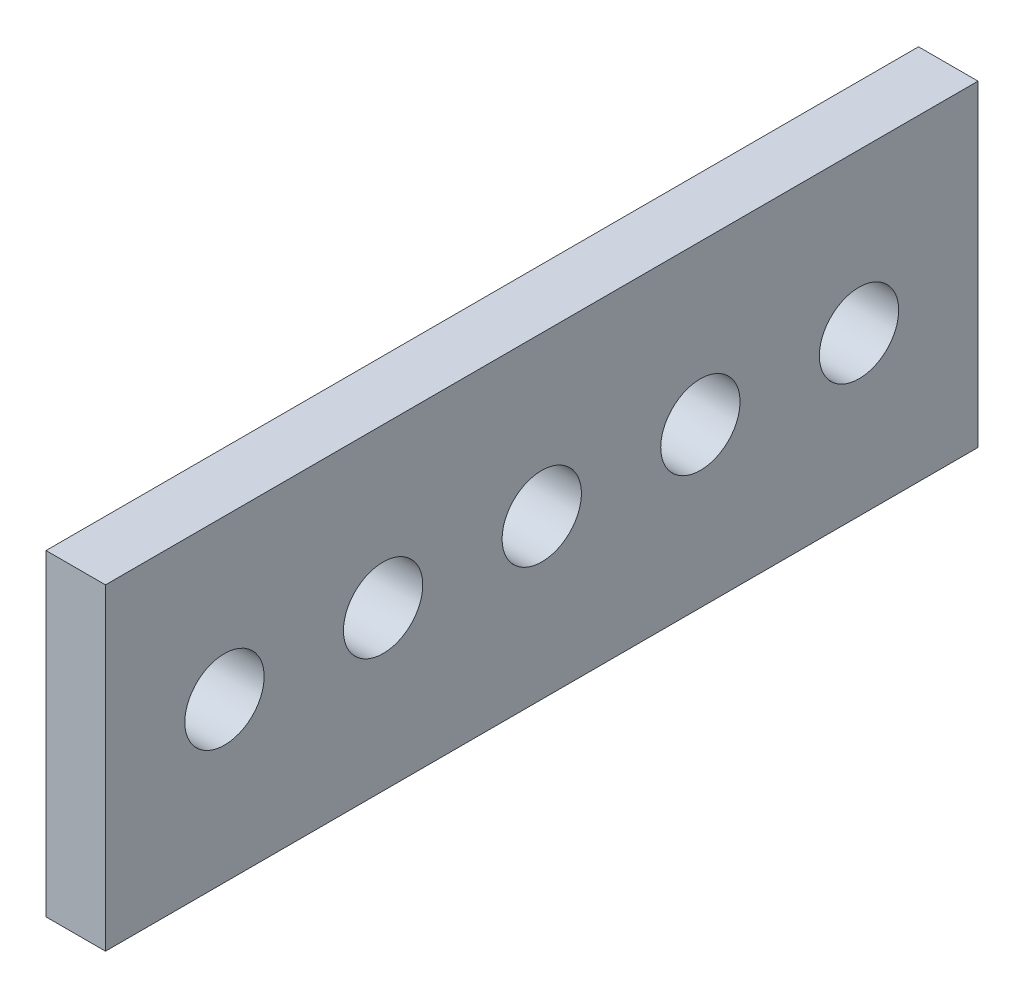
ISO-10303-21;
HEADER;
FILE_DESCRIPTION(('STEP AP214'),'2;1');
FILE_NAME('part.step','',(''),(''),'','','');
FILE_SCHEMA(('AUTOMOTIVE_DESIGN { 1 0 10303 214 1 1 1 1 }'));
ENDSEC;
DATA;
#1=APPLICATION_CONTEXT('core data for automotive mechanical design processes');
#2=APPLICATION_PROTOCOL_DEFINITION('international standard','automotive_design',2000,#1);
#3=PRODUCT_CONTEXT('',#1,'mechanical');
#4=PRODUCT('Part','Part','',(#3));
#5=PRODUCT_RELATED_PRODUCT_CATEGORY('part','',(#4));
#6=PRODUCT_DEFINITION_FORMATION('','',#4);
#7=PRODUCT_DEFINITION_CONTEXT('part definition',#1,'design');
#8=PRODUCT_DEFINITION('design','',#6,#7);
#9=PRODUCT_DEFINITION_SHAPE('','',#8);
#10=(LENGTH_UNIT() NAMED_UNIT(*) SI_UNIT(.MILLI.,.METRE.));
#11=(NAMED_UNIT(*) PLANE_ANGLE_UNIT() SI_UNIT($,.RADIAN.));
#12=(NAMED_UNIT(*) SI_UNIT($,.STERADIAN.) SOLID_ANGLE_UNIT());
#13=UNCERTAINTY_MEASURE_WITH_UNIT(LENGTH_MEASURE(1.E-05),#10,'distance_accuracy_value','');
#14=(GEOMETRIC_REPRESENTATION_CONTEXT(3) GLOBAL_UNCERTAINTY_ASSIGNED_CONTEXT((#13)) GLOBAL_UNIT_ASSIGNED_CONTEXT((#10,
#11,#12)) REPRESENTATION_CONTEXT('',''));
#15=CARTESIAN_POINT('',(0.,0.,0.));
#16=DIRECTION('',(0.,0.,1.));
#17=DIRECTION('',(1.,0.,0.));
#18=AXIS2_PLACEMENT_3D('',#15,#16,#17);
#19=CARTESIAN_POINT('',(4.7625,0.,0.));
#20=DIRECTION('',(-1.,0.,0.));
#21=DIRECTION('',(0.,0.,1.));
#22=AXIS2_PLACEMENT_3D('',#19,#20,#21);
#23=PLANE('',#22);
#24=CARTESIAN_POINT('',(4.7625,0.,-12.7));
#25=DIRECTION('',(1.,0.,0.));
#26=DIRECTION('',(0.,0.,-1.));
#27=AXIS2_PLACEMENT_3D('',#24,#25,#26);
#28=CIRCLE('',#27,3.175);
#29=CARTESIAN_POINT('',(4.7625,0.,-9.525));
#30=VERTEX_POINT('',#29);
#31=EDGE_CURVE('E128',#30,#30,#28,.T.);
#32=ORIENTED_EDGE('',*,*,#31,.F.);
#33=EDGE_LOOP('',(#32));
#34=FACE_BOUND('',#33,.T.);
#35=CARTESIAN_POINT('',(4.7625,0.,12.7));
#36=DIRECTION('',(1.,0.,0.));
#37=DIRECTION('',(0.,0.,-1.));
#38=AXIS2_PLACEMENT_3D('',#35,#36,#37);
#39=CIRCLE('',#38,3.175);
#40=CARTESIAN_POINT('',(4.7625,0.,15.875));
#41=VERTEX_POINT('',#40);
#42=EDGE_CURVE('E116',#41,#41,#39,.T.);
#43=ORIENTED_EDGE('',*,*,#42,.F.);
#44=EDGE_LOOP('',(#43));
#45=FACE_BOUND('',#44,.T.);
#46=DIRECTION('',(0.,1.,0.));
#47=VECTOR('',#46,1.);
#48=CARTESIAN_POINT('',(4.7625,-12.7,-34.925));
#49=LINE('',#48,#47);
#50=CARTESIAN_POINT('',(4.7625,-12.7,-34.925));
#51=VERTEX_POINT('',#50);
#52=CARTESIAN_POINT('',(4.7625,12.7,-34.925));
#53=VERTEX_POINT('',#52);
#54=EDGE_CURVE('E86',#51,#53,#49,.T.);
#55=ORIENTED_EDGE('',*,*,#54,.T.);
#56=DIRECTION('',(0.,0.,1.));
#57=VECTOR('',#56,1.);
#58=CARTESIAN_POINT('',(4.7625,12.7,34.925));
#59=LINE('',#58,#57);
#60=CARTESIAN_POINT('',(4.7625,12.7,34.925));
#61=VERTEX_POINT('',#60);
#62=EDGE_CURVE('E81',#53,#61,#59,.T.);
#63=ORIENTED_EDGE('',*,*,#62,.T.);
#64=DIRECTION('',(0.,-1.,0.));
#65=VECTOR('',#64,1.);
#66=CARTESIAN_POINT('',(4.7625,-12.7,34.925));
#67=LINE('',#66,#65);
#68=CARTESIAN_POINT('',(4.7625,-12.7,34.925));
#69=VERTEX_POINT('',#68);
#70=EDGE_CURVE('E84',#61,#69,#67,.T.);
#71=ORIENTED_EDGE('',*,*,#70,.T.);
#72=DIRECTION('',(0.,0.,-1.));
#73=VECTOR('',#72,1.);
#74=CARTESIAN_POINT('',(4.7625,-12.7,34.925));
#75=LINE('',#74,#73);
#76=EDGE_CURVE('E51',#69,#51,#75,.T.);
#77=ORIENTED_EDGE('',*,*,#76,.T.);
#78=EDGE_LOOP('',(#55,#63,#71,#77));
#79=FACE_BOUND('',#78,.T.);
#80=CARTESIAN_POINT('',(4.7625,0.,0.));
#81=DIRECTION('',(1.,0.,0.));
#82=DIRECTION('',(0.,0.,-1.));
#83=AXIS2_PLACEMENT_3D('',#80,#81,#82);
#84=CIRCLE('',#83,3.175);
#85=CARTESIAN_POINT('',(4.7625,0.,3.17499999999999));
#86=VERTEX_POINT('',#85);
#87=EDGE_CURVE('E101',#86,#86,#84,.T.);
#88=ORIENTED_EDGE('',*,*,#87,.F.);
#89=EDGE_LOOP('',(#88));
#90=FACE_BOUND('',#89,.T.);
#91=CARTESIAN_POINT('',(4.7625,0.,25.4));
#92=DIRECTION('',(1.,0.,0.));
#93=DIRECTION('',(0.,0.,-1.));
#94=AXIS2_PLACEMENT_3D('',#91,#92,#93);
#95=CIRCLE('',#94,3.17500000000001);
#96=CARTESIAN_POINT('',(4.7625,0.,28.575));
#97=VERTEX_POINT('',#96);
#98=EDGE_CURVE('E122',#97,#97,#95,.T.);
#99=ORIENTED_EDGE('',*,*,#98,.F.);
#100=EDGE_LOOP('',(#99));
#101=FACE_BOUND('',#100,.T.);
#102=CARTESIAN_POINT('',(4.7625,0.,-25.4));
#103=DIRECTION('',(1.,0.,0.));
#104=DIRECTION('',(0.,0.,-1.));
#105=AXIS2_PLACEMENT_3D('',#102,#103,#104);
#106=CIRCLE('',#105,3.175);
#107=CARTESIAN_POINT('',(4.7625,0.,-22.225));
#108=VERTEX_POINT('',#107);
#109=EDGE_CURVE('E134',#108,#108,#106,.T.);
#110=ORIENTED_EDGE('',*,*,#109,.F.);
#111=EDGE_LOOP('',(#110));
#112=FACE_BOUND('',#111,.T.);
#113=ADVANCED_FACE('F34',(#34,#45,#79,#90,#101,#112),#23,.F.);
#114=CARTESIAN_POINT('',(0.,0.,0.));
#115=DIRECTION('',(-1.,0.,0.));
#116=DIRECTION('',(0.,0.,1.));
#117=AXIS2_PLACEMENT_3D('',#114,#115,#116);
#118=PLANE('',#117);
#119=CARTESIAN_POINT('',(0.,0.,-12.7));
#120=DIRECTION('',(1.,0.,0.));
#121=DIRECTION('',(0.,0.,-1.));
#122=AXIS2_PLACEMENT_3D('',#119,#120,#121);
#123=CIRCLE('',#122,3.175);
#124=CARTESIAN_POINT('',(0.,0.,-9.525));
#125=VERTEX_POINT('',#124);
#126=EDGE_CURVE('E131',#125,#125,#123,.T.);
#127=ORIENTED_EDGE('',*,*,#126,.T.);
#128=EDGE_LOOP('',(#127));
#129=FACE_BOUND('',#128,.T.);
#130=CARTESIAN_POINT('',(0.,0.,12.7));
#131=DIRECTION('',(1.,0.,0.));
#132=DIRECTION('',(0.,0.,-1.));
#133=AXIS2_PLACEMENT_3D('',#130,#131,#132);
#134=CIRCLE('',#133,3.175);
#135=CARTESIAN_POINT('',(0.,0.,15.875));
#136=VERTEX_POINT('',#135);
#137=EDGE_CURVE('E119',#136,#136,#134,.T.);
#138=ORIENTED_EDGE('',*,*,#137,.T.);
#139=EDGE_LOOP('',(#138));
#140=FACE_BOUND('',#139,.T.);
#141=DIRECTION('',(0.,1.,0.));
#142=VECTOR('',#141,1.);
#143=CARTESIAN_POINT('',(0.,-12.7,-34.925));
#144=LINE('',#143,#142);
#145=CARTESIAN_POINT('',(0.,-12.7,-34.925));
#146=VERTEX_POINT('',#145);
#147=CARTESIAN_POINT('',(0.,12.7,-34.925));
#148=VERTEX_POINT('',#147);
#149=EDGE_CURVE('E98',#146,#148,#144,.T.);
#150=ORIENTED_EDGE('',*,*,#149,.F.);
#151=DIRECTION('',(0.,0.,-1.));
#152=VECTOR('',#151,1.);
#153=CARTESIAN_POINT('',(0.,-12.7,34.925));
#154=LINE('',#153,#152);
#155=CARTESIAN_POINT('',(0.,-12.7,34.925));
#156=VERTEX_POINT('',#155);
#157=EDGE_CURVE('E74',#156,#146,#154,.T.);
#158=ORIENTED_EDGE('',*,*,#157,.F.);
#159=DIRECTION('',(0.,-1.,0.));
#160=VECTOR('',#159,1.);
#161=CARTESIAN_POINT('',(0.,-12.7,34.925));
#162=LINE('',#161,#160);
#163=CARTESIAN_POINT('',(0.,12.7,34.925));
#164=VERTEX_POINT('',#163);
#165=EDGE_CURVE('E68',#164,#156,#162,.T.);
#166=ORIENTED_EDGE('',*,*,#165,.F.);
#167=DIRECTION('',(0.,0.,1.));
#168=VECTOR('',#167,1.);
#169=CARTESIAN_POINT('',(0.,12.7,34.925));
#170=LINE('',#169,#168);
#171=EDGE_CURVE('E90',#148,#164,#170,.T.);
#172=ORIENTED_EDGE('',*,*,#171,.F.);
#173=EDGE_LOOP('',(#150,#158,#166,#172));
#174=FACE_BOUND('',#173,.T.);
#175=CARTESIAN_POINT('',(0.,0.,0.));
#176=DIRECTION('',(1.,0.,0.));
#177=DIRECTION('',(0.,0.,-1.));
#178=AXIS2_PLACEMENT_3D('',#175,#176,#177);
#179=CIRCLE('',#178,3.175);
#180=CARTESIAN_POINT('',(0.,0.,3.17499999999999));
#181=VERTEX_POINT('',#180);
#182=EDGE_CURVE('E113',#181,#181,#179,.T.);
#183=ORIENTED_EDGE('',*,*,#182,.T.);
#184=EDGE_LOOP('',(#183));
#185=FACE_BOUND('',#184,.T.);
#186=CARTESIAN_POINT('',(0.,0.,25.4));
#187=DIRECTION('',(1.,0.,0.));
#188=DIRECTION('',(0.,0.,-1.));
#189=AXIS2_PLACEMENT_3D('',#186,#187,#188);
#190=CIRCLE('',#189,3.17500000000001);
#191=CARTESIAN_POINT('',(0.,0.,28.575));
#192=VERTEX_POINT('',#191);
#193=EDGE_CURVE('E125',#192,#192,#190,.T.);
#194=ORIENTED_EDGE('',*,*,#193,.T.);
#195=EDGE_LOOP('',(#194));
#196=FACE_BOUND('',#195,.T.);
#197=CARTESIAN_POINT('',(0.,0.,-25.4));
#198=DIRECTION('',(1.,0.,0.));
#199=DIRECTION('',(0.,0.,-1.));
#200=AXIS2_PLACEMENT_3D('',#197,#198,#199);
#201=CIRCLE('',#200,3.175);
#202=CARTESIAN_POINT('',(0.,0.,-22.225));
#203=VERTEX_POINT('',#202);
#204=EDGE_CURVE('E137',#203,#203,#201,.T.);
#205=ORIENTED_EDGE('',*,*,#204,.T.);
#206=EDGE_LOOP('',(#205));
#207=FACE_BOUND('',#206,.T.);
#208=ADVANCED_FACE('F109',(#129,#140,#174,#185,#196,#207),#118,.T.);
#209=CARTESIAN_POINT('',(4.7625,-12.7,-34.925));
#210=DIRECTION('',(0.,0.,1.));
#211=DIRECTION('',(1.,0.,0.));
#212=AXIS2_PLACEMENT_3D('',#209,#210,#211);
#213=PLANE('',#212);
#214=ORIENTED_EDGE('',*,*,#149,.T.);
#215=DIRECTION('',(-1.,0.,0.));
#216=VECTOR('',#215,1.);
#217=CARTESIAN_POINT('',(4.7625,12.7,-34.925));
#218=LINE('',#217,#216);
#219=EDGE_CURVE('E11',#53,#148,#218,.T.);
#220=ORIENTED_EDGE('',*,*,#219,.F.);
#221=ORIENTED_EDGE('',*,*,#54,.F.);
#222=DIRECTION('',(-1.,0.,0.));
#223=VECTOR('',#222,1.);
#224=CARTESIAN_POINT('',(4.7625,-12.7,-34.925));
#225=LINE('',#224,#223);
#226=EDGE_CURVE('E94',#51,#146,#225,.T.);
#227=ORIENTED_EDGE('',*,*,#226,.T.);
#228=EDGE_LOOP('',(#214,#220,#221,#227));
#229=FACE_BOUND('',#228,.T.);
#230=ADVANCED_FACE('F36',(#229),#213,.F.);
#231=CARTESIAN_POINT('',(4.7625,12.7,34.925));
#232=DIRECTION('',(0.,-1.,0.));
#233=DIRECTION('',(0.,0.,-1.));
#234=AXIS2_PLACEMENT_3D('',#231,#232,#233);
#235=PLANE('',#234);
#236=ORIENTED_EDGE('',*,*,#171,.T.);
#237=DIRECTION('',(-1.,0.,0.));
#238=VECTOR('',#237,1.);
#239=CARTESIAN_POINT('',(4.7625,12.7,34.925));
#240=LINE('',#239,#238);
#241=EDGE_CURVE('E43',#61,#164,#240,.T.);
#242=ORIENTED_EDGE('',*,*,#241,.F.);
#243=ORIENTED_EDGE('',*,*,#62,.F.);
#244=ORIENTED_EDGE('',*,*,#219,.T.);
#245=EDGE_LOOP('',(#236,#242,#243,#244));
#246=FACE_BOUND('',#245,.T.);
#247=ADVANCED_FACE('F89',(#246),#235,.F.);
#248=CARTESIAN_POINT('',(4.7625,-12.7,34.925));
#249=DIRECTION('',(0.,0.,-1.));
#250=DIRECTION('',(-1.,0.,0.));
#251=AXIS2_PLACEMENT_3D('',#248,#249,#250);
#252=PLANE('',#251);
#253=ORIENTED_EDGE('',*,*,#165,.T.);
#254=DIRECTION('',(-1.,0.,0.));
#255=VECTOR('',#254,1.);
#256=CARTESIAN_POINT('',(4.7625,-12.7,34.925));
#257=LINE('',#256,#255);
#258=EDGE_CURVE('E91',#69,#156,#257,.T.);
#259=ORIENTED_EDGE('',*,*,#258,.F.);
#260=ORIENTED_EDGE('',*,*,#70,.F.);
#261=ORIENTED_EDGE('',*,*,#241,.T.);
#262=EDGE_LOOP('',(#253,#259,#260,#261));
#263=FACE_BOUND('',#262,.T.);
#264=ADVANCED_FACE('F92',(#263),#252,.F.);
#265=CARTESIAN_POINT('',(4.7625,-12.7,34.925));
#266=DIRECTION('',(0.,1.,0.));
#267=DIRECTION('',(0.,0.,1.));
#268=AXIS2_PLACEMENT_3D('',#265,#266,#267);
#269=PLANE('',#268);
#270=ORIENTED_EDGE('',*,*,#157,.T.);
#271=ORIENTED_EDGE('',*,*,#226,.F.);
#272=ORIENTED_EDGE('',*,*,#76,.F.);
#273=ORIENTED_EDGE('',*,*,#258,.T.);
#274=EDGE_LOOP('',(#270,#271,#272,#273));
#275=FACE_BOUND('',#274,.T.);
#276=ADVANCED_FACE('F106',(#275),#269,.F.);
#277=CARTESIAN_POINT('',(4.7625,0.,0.));
#278=DIRECTION('',(-1.,0.,0.));
#279=DIRECTION('',(0.,0.,1.));
#280=AXIS2_PLACEMENT_3D('',#277,#278,#279);
#281=CYLINDRICAL_SURFACE('',#280,3.175);
#282=CARTESIAN_POINT('',(4.7625,0.,3.17499999999999));
#283=CARTESIAN_POINT('',(4.712890625,0.,3.17499999999999));
#284=CARTESIAN_POINT('',(4.66328125,0.,3.17499999999999));
#285=CARTESIAN_POINT('',(4.5640625,0.,3.17499999999999));
#286=CARTESIAN_POINT('',(4.514453125,0.,3.17499999999999));
#287=CARTESIAN_POINT('',(4.415234375,0.,3.17499999999999));
#288=CARTESIAN_POINT('',(4.365625,0.,3.17499999999999));
#289=CARTESIAN_POINT('',(4.26640625,0.,3.17499999999999));
#290=CARTESIAN_POINT('',(4.216796875,0.,3.17499999999999));
#291=CARTESIAN_POINT('',(4.117578125,0.,3.17499999999999));
#292=CARTESIAN_POINT('',(4.06796875,0.,3.17499999999999));
#293=CARTESIAN_POINT('',(3.96875,0.,3.17499999999999));
#294=CARTESIAN_POINT('',(3.919140625,0.,3.17499999999999));
#295=CARTESIAN_POINT('',(3.819921875,0.,3.17499999999999));
#296=CARTESIAN_POINT('',(3.7703125,0.,3.17499999999999));
#297=CARTESIAN_POINT('',(3.67109375,0.,3.17499999999999));
#298=CARTESIAN_POINT('',(3.621484375,0.,3.17499999999999));
#299=CARTESIAN_POINT('',(3.522265625,0.,3.17499999999999));
#300=CARTESIAN_POINT('',(3.47265625,0.,3.17499999999999));
#301=CARTESIAN_POINT('',(3.3734375,0.,3.17499999999999));
#302=CARTESIAN_POINT('',(3.323828125,0.,3.17499999999999));
#303=CARTESIAN_POINT('',(3.224609375,0.,3.17499999999999));
#304=CARTESIAN_POINT('',(3.175,0.,3.17499999999999));
#305=CARTESIAN_POINT('',(3.07578125,0.,3.17499999999999));
#306=CARTESIAN_POINT('',(3.026171875,0.,3.17499999999999));
#307=CARTESIAN_POINT('',(2.926953125,0.,3.17499999999999));
#308=CARTESIAN_POINT('',(2.87734375,0.,3.17499999999999));
#309=CARTESIAN_POINT('',(2.778125,0.,3.17499999999999));
#310=CARTESIAN_POINT('',(2.728515625,0.,3.17499999999999));
#311=CARTESIAN_POINT('',(2.629296875,0.,3.17499999999999));
#312=CARTESIAN_POINT('',(2.5796875,0.,3.17499999999999));
#313=CARTESIAN_POINT('',(2.48046875,0.,3.17499999999999));
#314=CARTESIAN_POINT('',(2.430859375,0.,3.17499999999999));
#315=CARTESIAN_POINT('',(2.331640625,0.,3.17499999999999));
#316=CARTESIAN_POINT('',(2.28203125,0.,3.17499999999999));
#317=CARTESIAN_POINT('',(2.1828125,0.,3.17499999999999));
#318=CARTESIAN_POINT('',(2.133203125,0.,3.17499999999999));
#319=CARTESIAN_POINT('',(2.033984375,0.,3.17499999999999));
#320=CARTESIAN_POINT('',(1.984375,0.,3.17499999999999));
#321=CARTESIAN_POINT('',(1.88515625,0.,3.17499999999999));
#322=CARTESIAN_POINT('',(1.835546875,0.,3.17499999999999));
#323=CARTESIAN_POINT('',(1.736328125,0.,3.17499999999999));
#324=CARTESIAN_POINT('',(1.68671875,0.,3.17499999999999));
#325=CARTESIAN_POINT('',(1.5875,0.,3.17499999999999));
#326=CARTESIAN_POINT('',(1.537890625,0.,3.17499999999999));
#327=CARTESIAN_POINT('',(1.438671875,0.,3.17499999999999));
#328=CARTESIAN_POINT('',(1.3890625,0.,3.17499999999999));
#329=CARTESIAN_POINT('',(1.28984375,0.,3.17499999999999));
#330=CARTESIAN_POINT('',(1.240234375,0.,3.17499999999999));
#331=CARTESIAN_POINT('',(1.141015625,0.,3.17499999999999));
#332=CARTESIAN_POINT('',(1.09140625,0.,3.17499999999999));
#333=CARTESIAN_POINT('',(0.9921875,0.,3.17499999999999));
#334=CARTESIAN_POINT('',(0.942578125,0.,3.17499999999999));
#335=CARTESIAN_POINT('',(0.843359375,0.,3.17499999999999));
#336=CARTESIAN_POINT('',(0.79375,0.,3.17499999999999));
#337=CARTESIAN_POINT('',(0.69453125,0.,3.17499999999999));
#338=CARTESIAN_POINT('',(0.644921875,0.,3.17499999999999));
#339=CARTESIAN_POINT('',(0.545703125,0.,3.17499999999999));
#340=CARTESIAN_POINT('',(0.49609375,0.,3.17499999999999));
#341=CARTESIAN_POINT('',(0.396875,0.,3.17499999999999));
#342=CARTESIAN_POINT('',(0.347265625,0.,3.17499999999999));
#343=CARTESIAN_POINT('',(0.248046875,0.,3.17499999999999));
#344=CARTESIAN_POINT('',(0.1984375,0.,3.17499999999999));
#345=CARTESIAN_POINT('',(0.09921875,0.,3.17499999999999));
#346=CARTESIAN_POINT('',(0.049609375,0.,3.17499999999999));
#347=CARTESIAN_POINT('',(0.,0.,3.17499999999999));
#348=B_SPLINE_CURVE_WITH_KNOTS('',3,(#282,#283,#284,#285,#286,#287,#288,#289,#290,#291,#292,
#293,#294,#295,#296,#297,#298,#299,#300,#301,#302,#303,#304,#305,#306,#307,#308,#309,#310,#311,
#312,#313,#314,#315,#316,#317,#318,#319,#320,#321,#322,#323,#324,#325,#326,#327,#328,#329,#330,
#331,#332,#333,#334,#335,#336,#337,#338,#339,#340,#341,#342,#343,#344,#345,#346,#347),
.UNSPECIFIED.,.F.,.F.,(4,2,2,2,2,2,2,2,2,2,2,2,2,2,2,2,2,2,2,2,2,2,2,2,2,2,2,2,2,2,2,2,4),(0.,
0.148828124999999,0.297656249999999,0.446484374999999,0.595312499999999,0.744140625,0.89296875,
1.041796875,1.190625,1.339453125,1.48828125,1.637109375,1.7859375,1.934765625,2.08359375,
2.232421875,2.38125,2.530078125,2.67890625,2.827734375,2.9765625,3.125390625,3.27421875,
3.423046875,3.571875,3.720703125,3.86953125,4.018359375,4.1671875,4.316015625,4.46484375,
4.613671875,4.7625),.UNSPECIFIED.);
#349=EDGE_CURVE('BSEAM157',#86,#181,#348,.T.);
#350=ORIENTED_EDGE('',*,*,#87,.T.);
#351=ORIENTED_EDGE('',*,*,#182,.F.);
#352=ORIENTED_EDGE('',*,*,#349,.T.);
#353=ORIENTED_EDGE('',*,*,#349,.F.);
#354=EDGE_LOOP('',(#350,#352,#351,#353));
#355=FACE_BOUND('',#354,.T.);
#356=ADVANCED_FACE('F157',(#355),#281,.F.);
#357=CARTESIAN_POINT('',(4.7625,0.,12.7));
#358=DIRECTION('',(-1.,0.,0.));
#359=DIRECTION('',(0.,0.,1.));
#360=AXIS2_PLACEMENT_3D('',#357,#358,#359);
#361=CYLINDRICAL_SURFACE('',#360,3.175);
#362=CARTESIAN_POINT('',(4.7625,0.,15.875));
#363=CARTESIAN_POINT('',(4.712890625,0.,15.875));
#364=CARTESIAN_POINT('',(4.66328125,0.,15.875));
#365=CARTESIAN_POINT('',(4.5640625,0.,15.875));
#366=CARTESIAN_POINT('',(4.514453125,0.,15.875));
#367=CARTESIAN_POINT('',(4.415234375,0.,15.875));
#368=CARTESIAN_POINT('',(4.365625,0.,15.875));
#369=CARTESIAN_POINT('',(4.26640625,0.,15.875));
#370=CARTESIAN_POINT('',(4.216796875,0.,15.875));
#371=CARTESIAN_POINT('',(4.117578125,0.,15.875));
#372=CARTESIAN_POINT('',(4.06796875,0.,15.875));
#373=CARTESIAN_POINT('',(3.96875,0.,15.875));
#374=CARTESIAN_POINT('',(3.919140625,0.,15.875));
#375=CARTESIAN_POINT('',(3.819921875,0.,15.875));
#376=CARTESIAN_POINT('',(3.7703125,0.,15.875));
#377=CARTESIAN_POINT('',(3.67109375,0.,15.875));
#378=CARTESIAN_POINT('',(3.621484375,0.,15.875));
#379=CARTESIAN_POINT('',(3.522265625,0.,15.875));
#380=CARTESIAN_POINT('',(3.47265625,0.,15.875));
#381=CARTESIAN_POINT('',(3.3734375,0.,15.875));
#382=CARTESIAN_POINT('',(3.323828125,0.,15.875));
#383=CARTESIAN_POINT('',(3.224609375,0.,15.875));
#384=CARTESIAN_POINT('',(3.175,0.,15.875));
#385=CARTESIAN_POINT('',(3.07578125,0.,15.875));
#386=CARTESIAN_POINT('',(3.026171875,0.,15.875));
#387=CARTESIAN_POINT('',(2.926953125,0.,15.875));
#388=CARTESIAN_POINT('',(2.87734375,0.,15.875));
#389=CARTESIAN_POINT('',(2.778125,0.,15.875));
#390=CARTESIAN_POINT('',(2.728515625,0.,15.875));
#391=CARTESIAN_POINT('',(2.629296875,0.,15.875));
#392=CARTESIAN_POINT('',(2.5796875,0.,15.875));
#393=CARTESIAN_POINT('',(2.48046875,0.,15.875));
#394=CARTESIAN_POINT('',(2.430859375,0.,15.875));
#395=CARTESIAN_POINT('',(2.331640625,0.,15.875));
#396=CARTESIAN_POINT('',(2.28203125,0.,15.875));
#397=CARTESIAN_POINT('',(2.1828125,0.,15.875));
#398=CARTESIAN_POINT('',(2.133203125,0.,15.875));
#399=CARTESIAN_POINT('',(2.033984375,0.,15.875));
#400=CARTESIAN_POINT('',(1.984375,0.,15.875));
#401=CARTESIAN_POINT('',(1.88515625,0.,15.875));
#402=CARTESIAN_POINT('',(1.835546875,0.,15.875));
#403=CARTESIAN_POINT('',(1.736328125,0.,15.875));
#404=CARTESIAN_POINT('',(1.68671875,0.,15.875));
#405=CARTESIAN_POINT('',(1.5875,0.,15.875));
#406=CARTESIAN_POINT('',(1.537890625,0.,15.875));
#407=CARTESIAN_POINT('',(1.438671875,0.,15.875));
#408=CARTESIAN_POINT('',(1.3890625,0.,15.875));
#409=CARTESIAN_POINT('',(1.28984375,0.,15.875));
#410=CARTESIAN_POINT('',(1.240234375,0.,15.875));
#411=CARTESIAN_POINT('',(1.141015625,0.,15.875));
#412=CARTESIAN_POINT('',(1.09140625,0.,15.875));
#413=CARTESIAN_POINT('',(0.9921875,0.,15.875));
#414=CARTESIAN_POINT('',(0.942578125,0.,15.875));
#415=CARTESIAN_POINT('',(0.843359375,0.,15.875));
#416=CARTESIAN_POINT('',(0.79375,0.,15.875));
#417=CARTESIAN_POINT('',(0.69453125,0.,15.875));
#418=CARTESIAN_POINT('',(0.644921875,0.,15.875));
#419=CARTESIAN_POINT('',(0.545703125,0.,15.875));
#420=CARTESIAN_POINT('',(0.49609375,0.,15.875));
#421=CARTESIAN_POINT('',(0.396875,0.,15.875));
#422=CARTESIAN_POINT('',(0.347265625,0.,15.875));
#423=CARTESIAN_POINT('',(0.248046875,0.,15.875));
#424=CARTESIAN_POINT('',(0.1984375,0.,15.875));
#425=CARTESIAN_POINT('',(0.09921875,0.,15.875));
#426=CARTESIAN_POINT('',(0.049609375,0.,15.875));
#427=CARTESIAN_POINT('',(0.,0.,15.875));
#428=B_SPLINE_CURVE_WITH_KNOTS('',3,(#362,#363,#364,#365,#366,#367,#368,#369,#370,#371,#372,
#373,#374,#375,#376,#377,#378,#379,#380,#381,#382,#383,#384,#385,#386,#387,#388,#389,#390,#391,
#392,#393,#394,#395,#396,#397,#398,#399,#400,#401,#402,#403,#404,#405,#406,#407,#408,#409,#410,
#411,#412,#413,#414,#415,#416,#417,#418,#419,#420,#421,#422,#423,#424,#425,#426,#427),
.UNSPECIFIED.,.F.,.F.,(4,2,2,2,2,2,2,2,2,2,2,2,2,2,2,2,2,2,2,2,2,2,2,2,2,2,2,2,2,2,2,2,4),(0.,
0.148828124999999,0.297656249999999,0.446484374999999,0.595312499999999,0.744140625,0.89296875,
1.041796875,1.190625,1.339453125,1.48828125,1.637109375,1.7859375,1.934765625,2.08359375,
2.232421875,2.38125,2.530078125,2.67890625,2.827734375,2.9765625,3.125390625,3.27421875,
3.423046875,3.571875,3.720703125,3.86953125,4.018359375,4.1671875,4.316015625,4.46484375,
4.613671875,4.7625),.UNSPECIFIED.);
#429=EDGE_CURVE('BSEAM203',#41,#136,#428,.T.);
#430=ORIENTED_EDGE('',*,*,#42,.T.);
#431=ORIENTED_EDGE('',*,*,#137,.F.);
#432=ORIENTED_EDGE('',*,*,#429,.T.);
#433=ORIENTED_EDGE('',*,*,#429,.F.);
#434=EDGE_LOOP('',(#430,#432,#431,#433));
#435=FACE_BOUND('',#434,.T.);
#436=ADVANCED_FACE('F203',(#435),#361,.F.);
#437=CARTESIAN_POINT('',(4.7625,0.,25.4));
#438=DIRECTION('',(-1.,0.,0.));
#439=DIRECTION('',(0.,0.,1.));
#440=AXIS2_PLACEMENT_3D('',#437,#438,#439);
#441=CYLINDRICAL_SURFACE('',#440,3.17500000000001);
#442=CARTESIAN_POINT('',(4.7625,0.,28.575));
#443=CARTESIAN_POINT('',(4.712890625,0.,28.575));
#444=CARTESIAN_POINT('',(4.66328125,0.,28.575));
#445=CARTESIAN_POINT('',(4.5640625,0.,28.575));
#446=CARTESIAN_POINT('',(4.514453125,0.,28.575));
#447=CARTESIAN_POINT('',(4.415234375,0.,28.575));
#448=CARTESIAN_POINT('',(4.365625,0.,28.575));
#449=CARTESIAN_POINT('',(4.26640625,0.,28.575));
#450=CARTESIAN_POINT('',(4.216796875,0.,28.575));
#451=CARTESIAN_POINT('',(4.117578125,0.,28.575));
#452=CARTESIAN_POINT('',(4.06796875,0.,28.575));
#453=CARTESIAN_POINT('',(3.96875,0.,28.575));
#454=CARTESIAN_POINT('',(3.919140625,0.,28.575));
#455=CARTESIAN_POINT('',(3.819921875,0.,28.575));
#456=CARTESIAN_POINT('',(3.7703125,0.,28.575));
#457=CARTESIAN_POINT('',(3.67109375,0.,28.575));
#458=CARTESIAN_POINT('',(3.621484375,0.,28.575));
#459=CARTESIAN_POINT('',(3.522265625,0.,28.575));
#460=CARTESIAN_POINT('',(3.47265625,0.,28.575));
#461=CARTESIAN_POINT('',(3.3734375,0.,28.575));
#462=CARTESIAN_POINT('',(3.323828125,0.,28.575));
#463=CARTESIAN_POINT('',(3.224609375,0.,28.575));
#464=CARTESIAN_POINT('',(3.175,0.,28.575));
#465=CARTESIAN_POINT('',(3.07578125,0.,28.575));
#466=CARTESIAN_POINT('',(3.026171875,0.,28.575));
#467=CARTESIAN_POINT('',(2.926953125,0.,28.575));
#468=CARTESIAN_POINT('',(2.87734375,0.,28.575));
#469=CARTESIAN_POINT('',(2.778125,0.,28.575));
#470=CARTESIAN_POINT('',(2.728515625,0.,28.575));
#471=CARTESIAN_POINT('',(2.629296875,0.,28.575));
#472=CARTESIAN_POINT('',(2.5796875,0.,28.575));
#473=CARTESIAN_POINT('',(2.48046875,0.,28.575));
#474=CARTESIAN_POINT('',(2.430859375,0.,28.575));
#475=CARTESIAN_POINT('',(2.331640625,0.,28.575));
#476=CARTESIAN_POINT('',(2.28203125,0.,28.575));
#477=CARTESIAN_POINT('',(2.1828125,0.,28.575));
#478=CARTESIAN_POINT('',(2.133203125,0.,28.575));
#479=CARTESIAN_POINT('',(2.033984375,0.,28.575));
#480=CARTESIAN_POINT('',(1.984375,0.,28.575));
#481=CARTESIAN_POINT('',(1.88515625,0.,28.575));
#482=CARTESIAN_POINT('',(1.835546875,0.,28.575));
#483=CARTESIAN_POINT('',(1.736328125,0.,28.575));
#484=CARTESIAN_POINT('',(1.68671875,0.,28.575));
#485=CARTESIAN_POINT('',(1.5875,0.,28.575));
#486=CARTESIAN_POINT('',(1.537890625,0.,28.575));
#487=CARTESIAN_POINT('',(1.438671875,0.,28.575));
#488=CARTESIAN_POINT('',(1.3890625,0.,28.575));
#489=CARTESIAN_POINT('',(1.28984375,0.,28.575));
#490=CARTESIAN_POINT('',(1.240234375,0.,28.575));
#491=CARTESIAN_POINT('',(1.141015625,0.,28.575));
#492=CARTESIAN_POINT('',(1.09140625,0.,28.575));
#493=CARTESIAN_POINT('',(0.9921875,0.,28.575));
#494=CARTESIAN_POINT('',(0.942578125,0.,28.575));
#495=CARTESIAN_POINT('',(0.843359375,0.,28.575));
#496=CARTESIAN_POINT('',(0.79375,0.,28.575));
#497=CARTESIAN_POINT('',(0.69453125,0.,28.575));
#498=CARTESIAN_POINT('',(0.644921875,0.,28.575));
#499=CARTESIAN_POINT('',(0.545703125,0.,28.575));
#500=CARTESIAN_POINT('',(0.49609375,0.,28.575));
#501=CARTESIAN_POINT('',(0.396875,0.,28.575));
#502=CARTESIAN_POINT('',(0.347265625,0.,28.575));
#503=CARTESIAN_POINT('',(0.248046875,0.,28.575));
#504=CARTESIAN_POINT('',(0.1984375,0.,28.575));
#505=CARTESIAN_POINT('',(0.09921875,0.,28.575));
#506=CARTESIAN_POINT('',(0.049609375,0.,28.575));
#507=CARTESIAN_POINT('',(0.,0.,28.575));
#508=B_SPLINE_CURVE_WITH_KNOTS('',3,(#442,#443,#444,#445,#446,#447,#448,#449,#450,#451,#452,
#453,#454,#455,#456,#457,#458,#459,#460,#461,#462,#463,#464,#465,#466,#467,#468,#469,#470,#471,
#472,#473,#474,#475,#476,#477,#478,#479,#480,#481,#482,#483,#484,#485,#486,#487,#488,#489,#490,
#491,#492,#493,#494,#495,#496,#497,#498,#499,#500,#501,#502,#503,#504,#505,#506,#507),
.UNSPECIFIED.,.F.,.F.,(4,2,2,2,2,2,2,2,2,2,2,2,2,2,2,2,2,2,2,2,2,2,2,2,2,2,2,2,2,2,2,2,4),(0.,
0.148828124999999,0.297656249999999,0.446484374999999,0.595312499999999,0.744140625,0.89296875,
1.041796875,1.190625,1.339453125,1.48828125,1.637109375,1.7859375,1.934765625,2.08359375,
2.232421875,2.38125,2.530078125,2.67890625,2.827734375,2.9765625,3.125390625,3.27421875,
3.423046875,3.571875,3.720703125,3.86953125,4.018359375,4.1671875,4.316015625,4.46484375,
4.613671875,4.7625),.UNSPECIFIED.);
#509=EDGE_CURVE('BSEAM211',#97,#192,#508,.T.);
#510=ORIENTED_EDGE('',*,*,#98,.T.);
#511=ORIENTED_EDGE('',*,*,#193,.F.);
#512=ORIENTED_EDGE('',*,*,#509,.T.);
#513=ORIENTED_EDGE('',*,*,#509,.F.);
#514=EDGE_LOOP('',(#510,#512,#511,#513));
#515=FACE_BOUND('',#514,.T.);
#516=ADVANCED_FACE('F211',(#515),#441,.F.);
#517=CARTESIAN_POINT('',(4.7625,0.,-12.7));
#518=DIRECTION('',(-1.,0.,0.));
#519=DIRECTION('',(0.,0.,1.));
#520=AXIS2_PLACEMENT_3D('',#517,#518,#519);
#521=CYLINDRICAL_SURFACE('',#520,3.175);
#522=CARTESIAN_POINT('',(4.7625,0.,-9.525));
#523=CARTESIAN_POINT('',(4.712890625,0.,-9.525));
#524=CARTESIAN_POINT('',(4.66328125,0.,-9.525));
#525=CARTESIAN_POINT('',(4.5640625,0.,-9.525));
#526=CARTESIAN_POINT('',(4.514453125,0.,-9.525));
#527=CARTESIAN_POINT('',(4.415234375,0.,-9.525));
#528=CARTESIAN_POINT('',(4.365625,0.,-9.525));
#529=CARTESIAN_POINT('',(4.26640625,0.,-9.525));
#530=CARTESIAN_POINT('',(4.216796875,0.,-9.525));
#531=CARTESIAN_POINT('',(4.117578125,0.,-9.525));
#532=CARTESIAN_POINT('',(4.06796875,0.,-9.525));
#533=CARTESIAN_POINT('',(3.96875,0.,-9.525));
#534=CARTESIAN_POINT('',(3.919140625,0.,-9.525));
#535=CARTESIAN_POINT('',(3.819921875,0.,-9.525));
#536=CARTESIAN_POINT('',(3.7703125,0.,-9.525));
#537=CARTESIAN_POINT('',(3.67109375,0.,-9.525));
#538=CARTESIAN_POINT('',(3.621484375,0.,-9.525));
#539=CARTESIAN_POINT('',(3.522265625,0.,-9.525));
#540=CARTESIAN_POINT('',(3.47265625,0.,-9.525));
#541=CARTESIAN_POINT('',(3.3734375,0.,-9.525));
#542=CARTESIAN_POINT('',(3.323828125,0.,-9.525));
#543=CARTESIAN_POINT('',(3.224609375,0.,-9.525));
#544=CARTESIAN_POINT('',(3.175,0.,-9.525));
#545=CARTESIAN_POINT('',(3.07578125,0.,-9.525));
#546=CARTESIAN_POINT('',(3.026171875,0.,-9.525));
#547=CARTESIAN_POINT('',(2.926953125,0.,-9.525));
#548=CARTESIAN_POINT('',(2.87734375,0.,-9.525));
#549=CARTESIAN_POINT('',(2.778125,0.,-9.525));
#550=CARTESIAN_POINT('',(2.728515625,0.,-9.525));
#551=CARTESIAN_POINT('',(2.629296875,0.,-9.525));
#552=CARTESIAN_POINT('',(2.5796875,0.,-9.525));
#553=CARTESIAN_POINT('',(2.48046875,0.,-9.525));
#554=CARTESIAN_POINT('',(2.430859375,0.,-9.525));
#555=CARTESIAN_POINT('',(2.331640625,0.,-9.525));
#556=CARTESIAN_POINT('',(2.28203125,0.,-9.525));
#557=CARTESIAN_POINT('',(2.1828125,0.,-9.525));
#558=CARTESIAN_POINT('',(2.133203125,0.,-9.525));
#559=CARTESIAN_POINT('',(2.033984375,0.,-9.525));
#560=CARTESIAN_POINT('',(1.984375,0.,-9.525));
#561=CARTESIAN_POINT('',(1.88515625,0.,-9.525));
#562=CARTESIAN_POINT('',(1.835546875,0.,-9.525));
#563=CARTESIAN_POINT('',(1.736328125,0.,-9.525));
#564=CARTESIAN_POINT('',(1.68671875,0.,-9.525));
#565=CARTESIAN_POINT('',(1.5875,0.,-9.525));
#566=CARTESIAN_POINT('',(1.537890625,0.,-9.525));
#567=CARTESIAN_POINT('',(1.438671875,0.,-9.525));
#568=CARTESIAN_POINT('',(1.3890625,0.,-9.525));
#569=CARTESIAN_POINT('',(1.28984375,0.,-9.525));
#570=CARTESIAN_POINT('',(1.240234375,0.,-9.525));
#571=CARTESIAN_POINT('',(1.141015625,0.,-9.525));
#572=CARTESIAN_POINT('',(1.09140625,0.,-9.525));
#573=CARTESIAN_POINT('',(0.9921875,0.,-9.525));
#574=CARTESIAN_POINT('',(0.942578125,0.,-9.525));
#575=CARTESIAN_POINT('',(0.843359375,0.,-9.525));
#576=CARTESIAN_POINT('',(0.79375,0.,-9.525));
#577=CARTESIAN_POINT('',(0.69453125,0.,-9.525));
#578=CARTESIAN_POINT('',(0.644921875,0.,-9.525));
#579=CARTESIAN_POINT('',(0.545703125,0.,-9.525));
#580=CARTESIAN_POINT('',(0.49609375,0.,-9.525));
#581=CARTESIAN_POINT('',(0.396875,0.,-9.525));
#582=CARTESIAN_POINT('',(0.347265625,0.,-9.525));
#583=CARTESIAN_POINT('',(0.248046875,0.,-9.525));
#584=CARTESIAN_POINT('',(0.1984375,0.,-9.525));
#585=CARTESIAN_POINT('',(0.09921875,0.,-9.525));
#586=CARTESIAN_POINT('',(0.049609375,0.,-9.525));
#587=CARTESIAN_POINT('',(0.,0.,-9.525));
#588=B_SPLINE_CURVE_WITH_KNOTS('',3,(#522,#523,#524,#525,#526,#527,#528,#529,#530,#531,#532,
#533,#534,#535,#536,#537,#538,#539,#540,#541,#542,#543,#544,#545,#546,#547,#548,#549,#550,#551,
#552,#553,#554,#555,#556,#557,#558,#559,#560,#561,#562,#563,#564,#565,#566,#567,#568,#569,#570,
#571,#572,#573,#574,#575,#576,#577,#578,#579,#580,#581,#582,#583,#584,#585,#586,#587),
.UNSPECIFIED.,.F.,.F.,(4,2,2,2,2,2,2,2,2,2,2,2,2,2,2,2,2,2,2,2,2,2,2,2,2,2,2,2,2,2,2,2,4),(0.,
0.148828124999999,0.297656249999999,0.446484374999999,0.595312499999999,0.744140625,0.89296875,
1.041796875,1.190625,1.339453125,1.48828125,1.637109375,1.7859375,1.934765625,2.08359375,
2.232421875,2.38125,2.530078125,2.67890625,2.827734375,2.9765625,3.125390625,3.27421875,
3.423046875,3.571875,3.720703125,3.86953125,4.018359375,4.1671875,4.316015625,4.46484375,
4.613671875,4.7625),.UNSPECIFIED.);
#589=EDGE_CURVE('BSEAM219',#30,#125,#588,.T.);
#590=ORIENTED_EDGE('',*,*,#31,.T.);
#591=ORIENTED_EDGE('',*,*,#126,.F.);
#592=ORIENTED_EDGE('',*,*,#589,.T.);
#593=ORIENTED_EDGE('',*,*,#589,.F.);
#594=EDGE_LOOP('',(#590,#592,#591,#593));
#595=FACE_BOUND('',#594,.T.);
#596=ADVANCED_FACE('F219',(#595),#521,.F.);
#597=CARTESIAN_POINT('',(4.7625,0.,-25.4));
#598=DIRECTION('',(-1.,0.,0.));
#599=DIRECTION('',(0.,0.,1.));
#600=AXIS2_PLACEMENT_3D('',#597,#598,#599);
#601=CYLINDRICAL_SURFACE('',#600,3.175);
#602=CARTESIAN_POINT('',(4.7625,0.,-22.225));
#603=CARTESIAN_POINT('',(4.712890625,0.,-22.225));
#604=CARTESIAN_POINT('',(4.66328125,0.,-22.225));
#605=CARTESIAN_POINT('',(4.5640625,0.,-22.225));
#606=CARTESIAN_POINT('',(4.514453125,0.,-22.225));
#607=CARTESIAN_POINT('',(4.415234375,0.,-22.225));
#608=CARTESIAN_POINT('',(4.365625,0.,-22.225));
#609=CARTESIAN_POINT('',(4.26640625,0.,-22.225));
#610=CARTESIAN_POINT('',(4.216796875,0.,-22.225));
#611=CARTESIAN_POINT('',(4.117578125,0.,-22.225));
#612=CARTESIAN_POINT('',(4.06796875,0.,-22.225));
#613=CARTESIAN_POINT('',(3.96875,0.,-22.225));
#614=CARTESIAN_POINT('',(3.919140625,0.,-22.225));
#615=CARTESIAN_POINT('',(3.819921875,0.,-22.225));
#616=CARTESIAN_POINT('',(3.7703125,0.,-22.225));
#617=CARTESIAN_POINT('',(3.67109375,0.,-22.225));
#618=CARTESIAN_POINT('',(3.621484375,0.,-22.225));
#619=CARTESIAN_POINT('',(3.522265625,0.,-22.225));
#620=CARTESIAN_POINT('',(3.47265625,0.,-22.225));
#621=CARTESIAN_POINT('',(3.3734375,0.,-22.225));
#622=CARTESIAN_POINT('',(3.323828125,0.,-22.225));
#623=CARTESIAN_POINT('',(3.224609375,0.,-22.225));
#624=CARTESIAN_POINT('',(3.175,0.,-22.225));
#625=CARTESIAN_POINT('',(3.07578125,0.,-22.225));
#626=CARTESIAN_POINT('',(3.026171875,0.,-22.225));
#627=CARTESIAN_POINT('',(2.926953125,0.,-22.225));
#628=CARTESIAN_POINT('',(2.87734375,0.,-22.225));
#629=CARTESIAN_POINT('',(2.778125,0.,-22.225));
#630=CARTESIAN_POINT('',(2.728515625,0.,-22.225));
#631=CARTESIAN_POINT('',(2.629296875,0.,-22.225));
#632=CARTESIAN_POINT('',(2.5796875,0.,-22.225));
#633=CARTESIAN_POINT('',(2.48046875,0.,-22.225));
#634=CARTESIAN_POINT('',(2.430859375,0.,-22.225));
#635=CARTESIAN_POINT('',(2.331640625,0.,-22.225));
#636=CARTESIAN_POINT('',(2.28203125,0.,-22.225));
#637=CARTESIAN_POINT('',(2.1828125,0.,-22.225));
#638=CARTESIAN_POINT('',(2.133203125,0.,-22.225));
#639=CARTESIAN_POINT('',(2.033984375,0.,-22.225));
#640=CARTESIAN_POINT('',(1.984375,0.,-22.225));
#641=CARTESIAN_POINT('',(1.88515625,0.,-22.225));
#642=CARTESIAN_POINT('',(1.835546875,0.,-22.225));
#643=CARTESIAN_POINT('',(1.736328125,0.,-22.225));
#644=CARTESIAN_POINT('',(1.68671875,0.,-22.225));
#645=CARTESIAN_POINT('',(1.5875,0.,-22.225));
#646=CARTESIAN_POINT('',(1.537890625,0.,-22.225));
#647=CARTESIAN_POINT('',(1.438671875,0.,-22.225));
#648=CARTESIAN_POINT('',(1.3890625,0.,-22.225));
#649=CARTESIAN_POINT('',(1.28984375,0.,-22.225));
#650=CARTESIAN_POINT('',(1.240234375,0.,-22.225));
#651=CARTESIAN_POINT('',(1.141015625,0.,-22.225));
#652=CARTESIAN_POINT('',(1.09140625,0.,-22.225));
#653=CARTESIAN_POINT('',(0.9921875,0.,-22.225));
#654=CARTESIAN_POINT('',(0.942578125,0.,-22.225));
#655=CARTESIAN_POINT('',(0.843359375,0.,-22.225));
#656=CARTESIAN_POINT('',(0.79375,0.,-22.225));
#657=CARTESIAN_POINT('',(0.69453125,0.,-22.225));
#658=CARTESIAN_POINT('',(0.644921875,0.,-22.225));
#659=CARTESIAN_POINT('',(0.545703125,0.,-22.225));
#660=CARTESIAN_POINT('',(0.49609375,0.,-22.225));
#661=CARTESIAN_POINT('',(0.396875,0.,-22.225));
#662=CARTESIAN_POINT('',(0.347265625,0.,-22.225));
#663=CARTESIAN_POINT('',(0.248046875,0.,-22.225));
#664=CARTESIAN_POINT('',(0.1984375,0.,-22.225));
#665=CARTESIAN_POINT('',(0.09921875,0.,-22.225));
#666=CARTESIAN_POINT('',(0.049609375,0.,-22.225));
#667=CARTESIAN_POINT('',(0.,0.,-22.225));
#668=B_SPLINE_CURVE_WITH_KNOTS('',3,(#602,#603,#604,#605,#606,#607,#608,#609,#610,#611,#612,
#613,#614,#615,#616,#617,#618,#619,#620,#621,#622,#623,#624,#625,#626,#627,#628,#629,#630,#631,
#632,#633,#634,#635,#636,#637,#638,#639,#640,#641,#642,#643,#644,#645,#646,#647,#648,#649,#650,
#651,#652,#653,#654,#655,#656,#657,#658,#659,#660,#661,#662,#663,#664,#665,#666,#667),
.UNSPECIFIED.,.F.,.F.,(4,2,2,2,2,2,2,2,2,2,2,2,2,2,2,2,2,2,2,2,2,2,2,2,2,2,2,2,2,2,2,2,4),(0.,
0.148828124999999,0.297656249999999,0.446484374999999,0.595312499999999,0.744140625,0.89296875,
1.041796875,1.190625,1.339453125,1.48828125,1.637109375,1.7859375,1.934765625,2.08359375,
2.232421875,2.38125,2.530078125,2.67890625,2.827734375,2.9765625,3.125390625,3.27421875,
3.423046875,3.571875,3.720703125,3.86953125,4.018359375,4.1671875,4.316015625,4.46484375,
4.613671875,4.7625),.UNSPECIFIED.);
#669=EDGE_CURVE('BSEAM143',#108,#203,#668,.T.);
#670=ORIENTED_EDGE('',*,*,#109,.T.);
#671=ORIENTED_EDGE('',*,*,#204,.F.);
#672=ORIENTED_EDGE('',*,*,#669,.T.);
#673=ORIENTED_EDGE('',*,*,#669,.F.);
#674=EDGE_LOOP('',(#670,#672,#671,#673));
#675=FACE_BOUND('',#674,.T.);
#676=ADVANCED_FACE('F143',(#675),#601,.F.);
#677=CLOSED_SHELL('',(#113,#208,#230,#247,#264,#276,#356,#436,#516,#596,#676));
#678=MANIFOLD_SOLID_BREP('B2',#677);
#679=ADVANCED_BREP_SHAPE_REPRESENTATION('',(#18,#678),#14);
#680=SHAPE_DEFINITION_REPRESENTATION(#9,#679);
ENDSEC;
END-ISO-10303-21;
